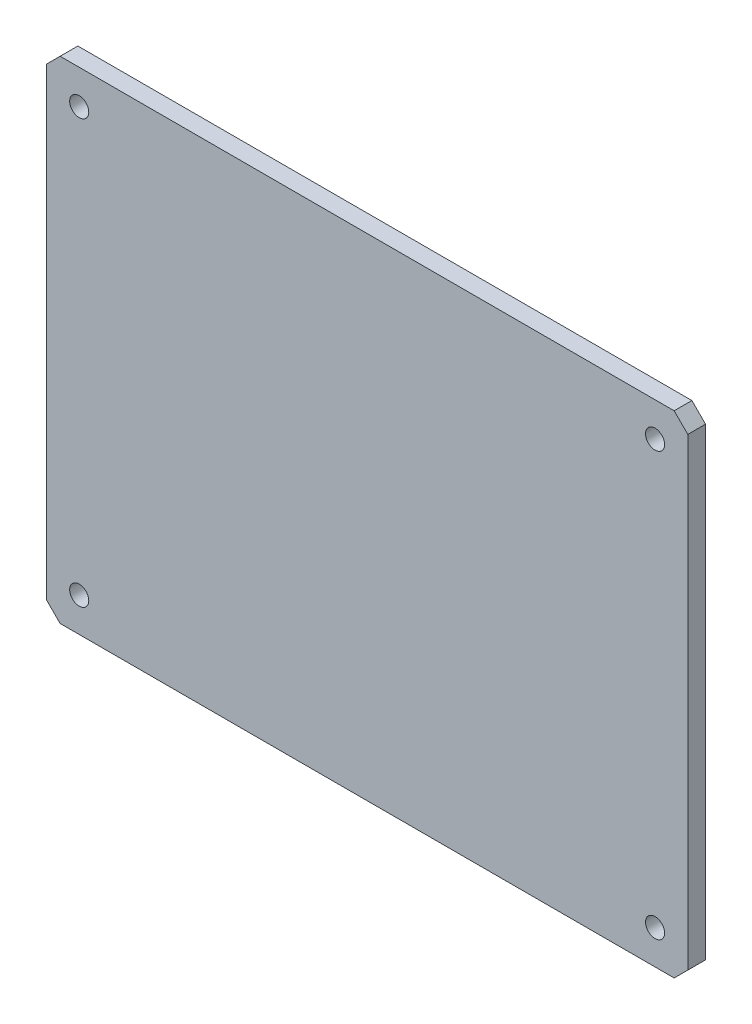
ISO-10303-21;
HEADER;
FILE_DESCRIPTION(('STEP AP214'),'2;1');
FILE_NAME('part.step','',(''),(''),'','','');
FILE_SCHEMA(('AUTOMOTIVE_DESIGN { 1 0 10303 214 1 1 1 1 }'));
ENDSEC;
DATA;
#1=APPLICATION_CONTEXT('core data for automotive mechanical design processes');
#2=APPLICATION_PROTOCOL_DEFINITION('international standard','automotive_design',2000,#1);
#3=PRODUCT_CONTEXT('',#1,'mechanical');
#4=PRODUCT('Part','Part','',(#3));
#5=PRODUCT_RELATED_PRODUCT_CATEGORY('part','',(#4));
#6=PRODUCT_DEFINITION_FORMATION('','',#4);
#7=PRODUCT_DEFINITION_CONTEXT('part definition',#1,'design');
#8=PRODUCT_DEFINITION('design','',#6,#7);
#9=PRODUCT_DEFINITION_SHAPE('','',#8);
#10=(LENGTH_UNIT() NAMED_UNIT(*) SI_UNIT(.MILLI.,.METRE.));
#11=(NAMED_UNIT(*) PLANE_ANGLE_UNIT() SI_UNIT($,.RADIAN.));
#12=(NAMED_UNIT(*) SI_UNIT($,.STERADIAN.) SOLID_ANGLE_UNIT());
#13=UNCERTAINTY_MEASURE_WITH_UNIT(LENGTH_MEASURE(1.E-05),#10,'distance_accuracy_value','');
#14=(GEOMETRIC_REPRESENTATION_CONTEXT(3) GLOBAL_UNCERTAINTY_ASSIGNED_CONTEXT((#13)) GLOBAL_UNIT_ASSIGNED_CONTEXT((#10,
#11,#12)) REPRESENTATION_CONTEXT('',''));
#15=CARTESIAN_POINT('',(0.,0.,0.));
#16=DIRECTION('',(0.,0.,1.));
#17=DIRECTION('',(1.,0.,0.));
#18=AXIS2_PLACEMENT_3D('',#15,#16,#17);
#19=CARTESIAN_POINT('',(0.,0.,2.6));
#20=DIRECTION('',(0.,0.,1.));
#21=DIRECTION('',(1.,0.,0.));
#22=AXIS2_PLACEMENT_3D('',#19,#20,#21);
#23=PLANE('',#22);
#24=CARTESIAN_POINT('',(-42.2,31.,2.6));
#25=DIRECTION('',(0.,0.,1.));
#26=DIRECTION('',(1.,0.,0.));
#27=AXIS2_PLACEMENT_3D('',#24,#25,#26);
#28=CIRCLE('',#27,1.4);
#29=CARTESIAN_POINT('',(-40.8,31.,2.6));
#30=VERTEX_POINT('',#29);
#31=EDGE_CURVE('E198',#30,#30,#28,.T.);
#32=ORIENTED_EDGE('',*,*,#31,.F.);
#33=EDGE_LOOP('',(#32));
#34=FACE_BOUND('',#33,.T.);
#35=CARTESIAN_POINT('',(-42.2,-31.,2.6));
#36=DIRECTION('',(0.,0.,1.));
#37=DIRECTION('',(1.,0.,0.));
#38=AXIS2_PLACEMENT_3D('',#35,#36,#37);
#39=CIRCLE('',#38,1.4);
#40=CARTESIAN_POINT('',(-40.8,-31.,2.6));
#41=VERTEX_POINT('',#40);
#42=EDGE_CURVE('E144',#41,#41,#39,.T.);
#43=ORIENTED_EDGE('',*,*,#42,.F.);
#44=EDGE_LOOP('',(#43));
#45=FACE_BOUND('',#44,.T.);
#46=DIRECTION('',(0.707106781186549,-0.707106781186546,0.));
#47=VECTOR('',#46,1.);
#48=CARTESIAN_POINT('',(-47.,-34.,2.6));
#49=LINE('',#48,#47);
#50=CARTESIAN_POINT('',(-47.,-34.,2.6));
#51=VERTEX_POINT('',#50);
#52=CARTESIAN_POINT('',(-45.,-36.,2.6));
#53=VERTEX_POINT('',#52);
#54=EDGE_CURVE('E155',#51,#53,#49,.T.);
#55=ORIENTED_EDGE('',*,*,#54,.T.);
#56=DIRECTION('',(1.,0.,0.));
#57=VECTOR('',#56,1.);
#58=CARTESIAN_POINT('',(-45.,-36.,2.6));
#59=LINE('',#58,#57);
#60=CARTESIAN_POINT('',(45.,-36.,2.6));
#61=VERTEX_POINT('',#60);
#62=EDGE_CURVE('E103',#53,#61,#59,.T.);
#63=ORIENTED_EDGE('',*,*,#62,.T.);
#64=DIRECTION('',(0.707106781186549,0.707106781186546,0.));
#65=VECTOR('',#64,1.);
#66=CARTESIAN_POINT('',(45.,-36.,2.6));
#67=LINE('',#66,#65);
#68=CARTESIAN_POINT('',(47.,-34.,2.6));
#69=VERTEX_POINT('',#68);
#70=EDGE_CURVE('E170',#61,#69,#67,.T.);
#71=ORIENTED_EDGE('',*,*,#70,.T.);
#72=DIRECTION('',(0.,1.,0.));
#73=VECTOR('',#72,1.);
#74=CARTESIAN_POINT('',(47.,-34.,2.6));
#75=LINE('',#74,#73);
#76=CARTESIAN_POINT('',(47.,34.,2.6));
#77=VERTEX_POINT('',#76);
#78=EDGE_CURVE('E183',#69,#77,#75,.T.);
#79=ORIENTED_EDGE('',*,*,#78,.T.);
#80=DIRECTION('',(-0.707106781186549,0.707106781186546,0.));
#81=VECTOR('',#80,1.);
#82=CARTESIAN_POINT('',(47.,34.,2.6));
#83=LINE('',#82,#81);
#84=CARTESIAN_POINT('',(45.,36.,2.6));
#85=VERTEX_POINT('',#84);
#86=EDGE_CURVE('E122',#77,#85,#83,.T.);
#87=ORIENTED_EDGE('',*,*,#86,.T.);
#88=DIRECTION('',(-1.,0.,0.));
#89=VECTOR('',#88,1.);
#90=CARTESIAN_POINT('',(45.,36.,2.6));
#91=LINE('',#90,#89);
#92=CARTESIAN_POINT('',(-45.,36.,2.6));
#93=VERTEX_POINT('',#92);
#94=EDGE_CURVE('E116',#85,#93,#91,.T.);
#95=ORIENTED_EDGE('',*,*,#94,.T.);
#96=DIRECTION('',(-0.707106781186549,-0.707106781186546,0.));
#97=VECTOR('',#96,1.);
#98=CARTESIAN_POINT('',(-45.,36.,2.6));
#99=LINE('',#98,#97);
#100=CARTESIAN_POINT('',(-47.,34.,2.6));
#101=VERTEX_POINT('',#100);
#102=EDGE_CURVE('E120',#93,#101,#99,.T.);
#103=ORIENTED_EDGE('',*,*,#102,.T.);
#104=DIRECTION('',(0.,-1.,0.));
#105=VECTOR('',#104,1.);
#106=CARTESIAN_POINT('',(-47.,34.,2.6));
#107=LINE('',#106,#105);
#108=EDGE_CURVE('E60',#101,#51,#107,.T.);
#109=ORIENTED_EDGE('',*,*,#108,.T.);
#110=EDGE_LOOP('',(#55,#63,#71,#79,#87,#95,#103,#109));
#111=FACE_BOUND('',#110,.T.);
#112=CARTESIAN_POINT('',(42.2,-31.,2.6));
#113=DIRECTION('',(0.,0.,1.));
#114=DIRECTION('',(1.,0.,0.));
#115=AXIS2_PLACEMENT_3D('',#112,#113,#114);
#116=CIRCLE('',#115,1.4);
#117=CARTESIAN_POINT('',(43.6,-31.,2.6));
#118=VERTEX_POINT('',#117);
#119=EDGE_CURVE('E192',#118,#118,#116,.T.);
#120=ORIENTED_EDGE('',*,*,#119,.F.);
#121=EDGE_LOOP('',(#120));
#122=FACE_BOUND('',#121,.T.);
#123=CARTESIAN_POINT('',(42.2,31.,2.6));
#124=DIRECTION('',(0.,0.,1.));
#125=DIRECTION('',(1.,0.,0.));
#126=AXIS2_PLACEMENT_3D('',#123,#124,#125);
#127=CIRCLE('',#126,1.4);
#128=CARTESIAN_POINT('',(43.6,31.,2.6));
#129=VERTEX_POINT('',#128);
#130=EDGE_CURVE('E204',#129,#129,#127,.T.);
#131=ORIENTED_EDGE('',*,*,#130,.F.);
#132=EDGE_LOOP('',(#131));
#133=FACE_BOUND('',#132,.T.);
#134=ADVANCED_FACE('F43',(#34,#45,#111,#122,#133),#23,.T.);
#135=CARTESIAN_POINT('',(0.,0.,0.));
#136=DIRECTION('',(0.,0.,1.));
#137=DIRECTION('',(1.,0.,0.));
#138=AXIS2_PLACEMENT_3D('',#135,#136,#137);
#139=PLANE('',#138);
#140=DIRECTION('',(0.707106781186549,-0.707106781186546,0.));
#141=VECTOR('',#140,1.);
#142=CARTESIAN_POINT('',(-47.,-34.,0.));
#143=LINE('',#142,#141);
#144=CARTESIAN_POINT('',(-47.,-34.,0.));
#145=VERTEX_POINT('',#144);
#146=CARTESIAN_POINT('',(-45.,-36.,0.));
#147=VERTEX_POINT('',#146);
#148=EDGE_CURVE('E140',#145,#147,#143,.T.);
#149=ORIENTED_EDGE('',*,*,#148,.F.);
#150=DIRECTION('',(0.,-1.,0.));
#151=VECTOR('',#150,1.);
#152=CARTESIAN_POINT('',(-47.,34.,0.));
#153=LINE('',#152,#151);
#154=CARTESIAN_POINT('',(-47.,34.,0.));
#155=VERTEX_POINT('',#154);
#156=EDGE_CURVE('E95',#155,#145,#153,.T.);
#157=ORIENTED_EDGE('',*,*,#156,.F.);
#158=DIRECTION('',(-0.707106781186549,-0.707106781186546,0.));
#159=VECTOR('',#158,1.);
#160=CARTESIAN_POINT('',(-45.,36.,0.));
#161=LINE('',#160,#159);
#162=CARTESIAN_POINT('',(-45.,36.,0.));
#163=VERTEX_POINT('',#162);
#164=EDGE_CURVE('E89',#163,#155,#161,.T.);
#165=ORIENTED_EDGE('',*,*,#164,.F.);
#166=DIRECTION('',(-1.,0.,0.));
#167=VECTOR('',#166,1.);
#168=CARTESIAN_POINT('',(45.,36.,0.));
#169=LINE('',#168,#167);
#170=CARTESIAN_POINT('',(45.,36.,0.));
#171=VERTEX_POINT('',#170);
#172=EDGE_CURVE('E130',#171,#163,#169,.T.);
#173=ORIENTED_EDGE('',*,*,#172,.F.);
#174=DIRECTION('',(-0.707106781186549,0.707106781186546,0.));
#175=VECTOR('',#174,1.);
#176=CARTESIAN_POINT('',(47.,34.,0.));
#177=LINE('',#176,#175);
#178=CARTESIAN_POINT('',(47.,34.,0.));
#179=VERTEX_POINT('',#178);
#180=EDGE_CURVE('E150',#179,#171,#177,.T.);
#181=ORIENTED_EDGE('',*,*,#180,.F.);
#182=DIRECTION('',(0.,1.,0.));
#183=VECTOR('',#182,1.);
#184=CARTESIAN_POINT('',(47.,-34.,0.));
#185=LINE('',#184,#183);
#186=CARTESIAN_POINT('',(47.,-34.,0.));
#187=VERTEX_POINT('',#186);
#188=EDGE_CURVE('E148',#187,#179,#185,.T.);
#189=ORIENTED_EDGE('',*,*,#188,.F.);
#190=DIRECTION('',(0.707106781186549,0.707106781186546,0.));
#191=VECTOR('',#190,1.);
#192=CARTESIAN_POINT('',(45.,-36.,0.));
#193=LINE('',#192,#191);
#194=CARTESIAN_POINT('',(45.,-36.,0.));
#195=VERTEX_POINT('',#194);
#196=EDGE_CURVE('E146',#195,#187,#193,.T.);
#197=ORIENTED_EDGE('',*,*,#196,.F.);
#198=DIRECTION('',(1.,0.,0.));
#199=VECTOR('',#198,1.);
#200=CARTESIAN_POINT('',(-45.,-36.,0.));
#201=LINE('',#200,#199);
#202=EDGE_CURVE('E143',#147,#195,#201,.T.);
#203=ORIENTED_EDGE('',*,*,#202,.F.);
#204=EDGE_LOOP('',(#149,#157,#165,#173,#181,#189,#197,#203));
#205=FACE_BOUND('',#204,.T.);
#206=CARTESIAN_POINT('',(-42.2,-31.,0.));
#207=DIRECTION('',(0.,0.,1.));
#208=DIRECTION('',(1.,0.,0.));
#209=AXIS2_PLACEMENT_3D('',#206,#207,#208);
#210=CIRCLE('',#209,1.4);
#211=CARTESIAN_POINT('',(-40.8,-31.,0.));
#212=VERTEX_POINT('',#211);
#213=EDGE_CURVE('E189',#212,#212,#210,.T.);
#214=ORIENTED_EDGE('',*,*,#213,.T.);
#215=EDGE_LOOP('',(#214));
#216=FACE_BOUND('',#215,.T.);
#217=CARTESIAN_POINT('',(42.2,-31.,0.));
#218=DIRECTION('',(0.,0.,1.));
#219=DIRECTION('',(1.,0.,0.));
#220=AXIS2_PLACEMENT_3D('',#217,#218,#219);
#221=CIRCLE('',#220,1.4);
#222=CARTESIAN_POINT('',(43.6,-31.,0.));
#223=VERTEX_POINT('',#222);
#224=EDGE_CURVE('E195',#223,#223,#221,.T.);
#225=ORIENTED_EDGE('',*,*,#224,.T.);
#226=EDGE_LOOP('',(#225));
#227=FACE_BOUND('',#226,.T.);
#228=CARTESIAN_POINT('',(-42.2,31.,0.));
#229=DIRECTION('',(0.,0.,1.));
#230=DIRECTION('',(1.,0.,0.));
#231=AXIS2_PLACEMENT_3D('',#228,#229,#230);
#232=CIRCLE('',#231,1.4);
#233=CARTESIAN_POINT('',(-40.8,31.,0.));
#234=VERTEX_POINT('',#233);
#235=EDGE_CURVE('E201',#234,#234,#232,.T.);
#236=ORIENTED_EDGE('',*,*,#235,.T.);
#237=EDGE_LOOP('',(#236));
#238=FACE_BOUND('',#237,.T.);
#239=CARTESIAN_POINT('',(42.2,31.,0.));
#240=DIRECTION('',(0.,0.,1.));
#241=DIRECTION('',(1.,0.,0.));
#242=AXIS2_PLACEMENT_3D('',#239,#240,#241);
#243=CIRCLE('',#242,1.4);
#244=CARTESIAN_POINT('',(43.6,31.,0.));
#245=VERTEX_POINT('',#244);
#246=EDGE_CURVE('E207',#245,#245,#243,.T.);
#247=ORIENTED_EDGE('',*,*,#246,.T.);
#248=EDGE_LOOP('',(#247));
#249=FACE_BOUND('',#248,.T.);
#250=ADVANCED_FACE('F174',(#205,#216,#227,#238,#249),#139,.F.);
#251=CARTESIAN_POINT('',(-47.,-34.,2.6));
#252=DIRECTION('',(0.707106781186546,0.707106781186549,0.));
#253=DIRECTION('',(-0.707106781186549,0.707106781186546,0.));
#254=AXIS2_PLACEMENT_3D('',#251,#252,#253);
#255=PLANE('',#254);
#256=ORIENTED_EDGE('',*,*,#148,.T.);
#257=DIRECTION('',(0.,0.,-1.));
#258=VECTOR('',#257,1.);
#259=CARTESIAN_POINT('',(-45.,-36.,2.6));
#260=LINE('',#259,#258);
#261=EDGE_CURVE('E11',#53,#147,#260,.T.);
#262=ORIENTED_EDGE('',*,*,#261,.F.);
#263=ORIENTED_EDGE('',*,*,#54,.F.);
#264=DIRECTION('',(0.,0.,-1.));
#265=VECTOR('',#264,1.);
#266=CARTESIAN_POINT('',(-47.,-34.,2.6));
#267=LINE('',#266,#265);
#268=EDGE_CURVE('E136',#51,#145,#267,.T.);
#269=ORIENTED_EDGE('',*,*,#268,.T.);
#270=EDGE_LOOP('',(#256,#262,#263,#269));
#271=FACE_BOUND('',#270,.T.);
#272=ADVANCED_FACE('F45',(#271),#255,.F.);
#273=CARTESIAN_POINT('',(-45.,-36.,2.6));
#274=DIRECTION('',(0.,1.,0.));
#275=DIRECTION('',(0.,0.,1.));
#276=AXIS2_PLACEMENT_3D('',#273,#274,#275);
#277=PLANE('',#276);
#278=ORIENTED_EDGE('',*,*,#202,.T.);
#279=DIRECTION('',(0.,0.,-1.));
#280=VECTOR('',#279,1.);
#281=CARTESIAN_POINT('',(45.,-36.,2.6));
#282=LINE('',#281,#280);
#283=EDGE_CURVE('E52',#61,#195,#282,.T.);
#284=ORIENTED_EDGE('',*,*,#283,.F.);
#285=ORIENTED_EDGE('',*,*,#62,.F.);
#286=ORIENTED_EDGE('',*,*,#261,.T.);
#287=EDGE_LOOP('',(#278,#284,#285,#286));
#288=FACE_BOUND('',#287,.T.);
#289=ADVANCED_FACE('F241',(#288),#277,.F.);
#290=CARTESIAN_POINT('',(45.,-36.,2.6));
#291=DIRECTION('',(-0.707106781186546,0.707106781186549,0.));
#292=DIRECTION('',(-0.707106781186549,-0.707106781186546,0.));
#293=AXIS2_PLACEMENT_3D('',#290,#291,#292);
#294=PLANE('',#293);
#295=ORIENTED_EDGE('',*,*,#196,.T.);
#296=DIRECTION('',(0.,0.,-1.));
#297=VECTOR('',#296,1.);
#298=CARTESIAN_POINT('',(47.,-34.,2.6));
#299=LINE('',#298,#297);
#300=EDGE_CURVE('E162',#69,#187,#299,.T.);
#301=ORIENTED_EDGE('',*,*,#300,.F.);
#302=ORIENTED_EDGE('',*,*,#70,.F.);
#303=ORIENTED_EDGE('',*,*,#283,.T.);
#304=EDGE_LOOP('',(#295,#301,#302,#303));
#305=FACE_BOUND('',#304,.T.);
#306=ADVANCED_FACE('F168',(#305),#294,.F.);
#307=CARTESIAN_POINT('',(47.,-34.,2.6));
#308=DIRECTION('',(-1.,0.,0.));
#309=DIRECTION('',(0.,0.,1.));
#310=AXIS2_PLACEMENT_3D('',#307,#308,#309);
#311=PLANE('',#310);
#312=ORIENTED_EDGE('',*,*,#188,.T.);
#313=DIRECTION('',(0.,0.,-1.));
#314=VECTOR('',#313,1.);
#315=CARTESIAN_POINT('',(47.,34.,2.6));
#316=LINE('',#315,#314);
#317=EDGE_CURVE('E159',#77,#179,#316,.T.);
#318=ORIENTED_EDGE('',*,*,#317,.F.);
#319=ORIENTED_EDGE('',*,*,#78,.F.);
#320=ORIENTED_EDGE('',*,*,#300,.T.);
#321=EDGE_LOOP('',(#312,#318,#319,#320));
#322=FACE_BOUND('',#321,.T.);
#323=ADVANCED_FACE('F179',(#322),#311,.F.);
#324=CARTESIAN_POINT('',(47.,34.,2.6));
#325=DIRECTION('',(-0.707106781186546,-0.707106781186549,0.));
#326=DIRECTION('',(0.707106781186549,-0.707106781186546,0.));
#327=AXIS2_PLACEMENT_3D('',#324,#325,#326);
#328=PLANE('',#327);
#329=ORIENTED_EDGE('',*,*,#180,.T.);
#330=DIRECTION('',(0.,0.,-1.));
#331=VECTOR('',#330,1.);
#332=CARTESIAN_POINT('',(45.,36.,2.6));
#333=LINE('',#332,#331);
#334=EDGE_CURVE('E131',#85,#171,#333,.T.);
#335=ORIENTED_EDGE('',*,*,#334,.F.);
#336=ORIENTED_EDGE('',*,*,#86,.F.);
#337=ORIENTED_EDGE('',*,*,#317,.T.);
#338=EDGE_LOOP('',(#329,#335,#336,#337));
#339=FACE_BOUND('',#338,.T.);
#340=ADVANCED_FACE('F182',(#339),#328,.F.);
#341=CARTESIAN_POINT('',(45.,36.,2.6));
#342=DIRECTION('',(0.,-1.,0.));
#343=DIRECTION('',(0.,0.,-1.));
#344=AXIS2_PLACEMENT_3D('',#341,#342,#343);
#345=PLANE('',#344);
#346=ORIENTED_EDGE('',*,*,#172,.T.);
#347=DIRECTION('',(0.,0.,-1.));
#348=VECTOR('',#347,1.);
#349=CARTESIAN_POINT('',(-45.,36.,2.6));
#350=LINE('',#349,#348);
#351=EDGE_CURVE('E127',#93,#163,#350,.T.);
#352=ORIENTED_EDGE('',*,*,#351,.F.);
#353=ORIENTED_EDGE('',*,*,#94,.F.);
#354=ORIENTED_EDGE('',*,*,#334,.T.);
#355=EDGE_LOOP('',(#346,#352,#353,#354));
#356=FACE_BOUND('',#355,.T.);
#357=ADVANCED_FACE('F128',(#356),#345,.F.);
#358=CARTESIAN_POINT('',(-45.,36.,2.6));
#359=DIRECTION('',(0.707106781186546,-0.707106781186549,0.));
#360=DIRECTION('',(0.707106781186549,0.707106781186546,0.));
#361=AXIS2_PLACEMENT_3D('',#358,#359,#360);
#362=PLANE('',#361);
#363=ORIENTED_EDGE('',*,*,#164,.T.);
#364=DIRECTION('',(0.,0.,-1.));
#365=VECTOR('',#364,1.);
#366=CARTESIAN_POINT('',(-47.,34.,2.6));
#367=LINE('',#366,#365);
#368=EDGE_CURVE('E132',#101,#155,#367,.T.);
#369=ORIENTED_EDGE('',*,*,#368,.F.);
#370=ORIENTED_EDGE('',*,*,#102,.F.);
#371=ORIENTED_EDGE('',*,*,#351,.T.);
#372=EDGE_LOOP('',(#363,#369,#370,#371));
#373=FACE_BOUND('',#372,.T.);
#374=ADVANCED_FACE('F134',(#373),#362,.F.);
#375=CARTESIAN_POINT('',(-47.,34.,2.6));
#376=DIRECTION('',(1.,0.,0.));
#377=DIRECTION('',(0.,0.,-1.));
#378=AXIS2_PLACEMENT_3D('',#375,#376,#377);
#379=PLANE('',#378);
#380=ORIENTED_EDGE('',*,*,#156,.T.);
#381=ORIENTED_EDGE('',*,*,#268,.F.);
#382=ORIENTED_EDGE('',*,*,#108,.F.);
#383=ORIENTED_EDGE('',*,*,#368,.T.);
#384=EDGE_LOOP('',(#380,#381,#382,#383));
#385=FACE_BOUND('',#384,.T.);
#386=ADVANCED_FACE('F229',(#385),#379,.F.);
#387=CARTESIAN_POINT('',(-42.2,-31.,2.6));
#388=DIRECTION('',(0.,0.,-1.));
#389=DIRECTION('',(-1.,0.,0.));
#390=AXIS2_PLACEMENT_3D('',#387,#388,#389);
#391=CYLINDRICAL_SURFACE('',#390,1.4);
#392=ORIENTED_EDGE('',*,*,#42,.T.);
#393=EDGE_LOOP('',(#392));
#394=FACE_BOUND('',#393,.T.);
#395=ORIENTED_EDGE('',*,*,#213,.F.);
#396=EDGE_LOOP('',(#395));
#397=FACE_BOUND('',#396,.T.);
#398=ADVANCED_FACE('F226',(#394,#397),#391,.F.);
#399=CARTESIAN_POINT('',(42.2,-31.,2.6));
#400=DIRECTION('',(0.,0.,-1.));
#401=DIRECTION('',(-1.,0.,0.));
#402=AXIS2_PLACEMENT_3D('',#399,#400,#401);
#403=CYLINDRICAL_SURFACE('',#402,1.4);
#404=ORIENTED_EDGE('',*,*,#119,.T.);
#405=EDGE_LOOP('',(#404));
#406=FACE_BOUND('',#405,.T.);
#407=ORIENTED_EDGE('',*,*,#224,.F.);
#408=EDGE_LOOP('',(#407));
#409=FACE_BOUND('',#408,.T.);
#410=ADVANCED_FACE('F304',(#406,#409),#403,.F.);
#411=CARTESIAN_POINT('',(-42.2,31.,2.6));
#412=DIRECTION('',(0.,0.,-1.));
#413=DIRECTION('',(-1.,0.,0.));
#414=AXIS2_PLACEMENT_3D('',#411,#412,#413);
#415=CYLINDRICAL_SURFACE('',#414,1.4);
#416=ORIENTED_EDGE('',*,*,#31,.T.);
#417=EDGE_LOOP('',(#416));
#418=FACE_BOUND('',#417,.T.);
#419=ORIENTED_EDGE('',*,*,#235,.F.);
#420=EDGE_LOOP('',(#419));
#421=FACE_BOUND('',#420,.T.);
#422=ADVANCED_FACE('F312',(#418,#421),#415,.F.);
#423=CARTESIAN_POINT('',(42.2,31.,2.6));
#424=DIRECTION('',(0.,0.,-1.));
#425=DIRECTION('',(-1.,0.,0.));
#426=AXIS2_PLACEMENT_3D('',#423,#424,#425);
#427=CYLINDRICAL_SURFACE('',#426,1.4);
#428=ORIENTED_EDGE('',*,*,#130,.T.);
#429=EDGE_LOOP('',(#428));
#430=FACE_BOUND('',#429,.T.);
#431=ORIENTED_EDGE('',*,*,#246,.F.);
#432=EDGE_LOOP('',(#431));
#433=FACE_BOUND('',#432,.T.);
#434=ADVANCED_FACE('F213',(#430,#433),#427,.F.);
#435=CLOSED_SHELL('',(#134,#250,#272,#289,#306,#323,#340,#357,#374,#386,#398,#410,#422,#434));
#436=MANIFOLD_SOLID_BREP('B2',#435);
#437=ADVANCED_BREP_SHAPE_REPRESENTATION('',(#18,#436),#14);
#438=SHAPE_DEFINITION_REPRESENTATION(#9,#437);
ENDSEC;
END-ISO-10303-21;
